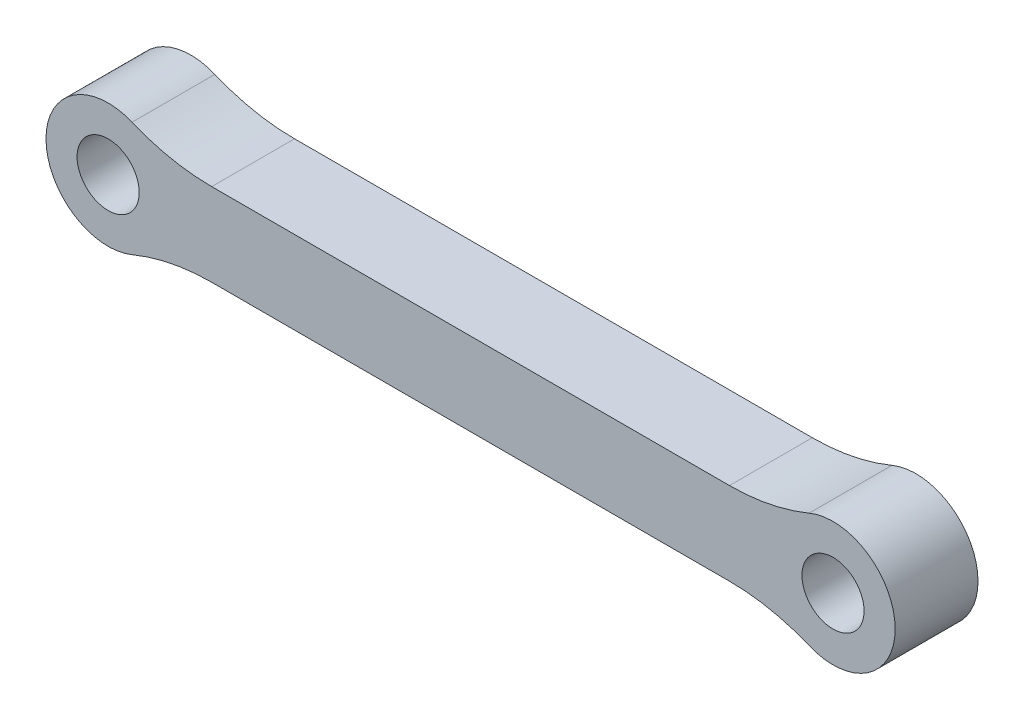
ISO-10303-21;
HEADER;
FILE_DESCRIPTION(('STEP AP214'),'2;1');
FILE_NAME('part.step','',(''),(''),'','','');
FILE_SCHEMA(('AUTOMOTIVE_DESIGN { 1 0 10303 214 1 1 1 1 }'));
ENDSEC;
DATA;
#1=APPLICATION_CONTEXT('core data for automotive mechanical design processes');
#2=APPLICATION_PROTOCOL_DEFINITION('international standard','automotive_design',2000,#1);
#3=PRODUCT_CONTEXT('',#1,'mechanical');
#4=PRODUCT('Part','Part','',(#3));
#5=PRODUCT_RELATED_PRODUCT_CATEGORY('part','',(#4));
#6=PRODUCT_DEFINITION_FORMATION('','',#4);
#7=PRODUCT_DEFINITION_CONTEXT('part definition',#1,'design');
#8=PRODUCT_DEFINITION('design','',#6,#7);
#9=PRODUCT_DEFINITION_SHAPE('','',#8);
#10=(LENGTH_UNIT() NAMED_UNIT(*) SI_UNIT(.MILLI.,.METRE.));
#11=(NAMED_UNIT(*) PLANE_ANGLE_UNIT() SI_UNIT($,.RADIAN.));
#12=(NAMED_UNIT(*) SI_UNIT($,.STERADIAN.) SOLID_ANGLE_UNIT());
#13=UNCERTAINTY_MEASURE_WITH_UNIT(LENGTH_MEASURE(1.E-05),#10,'distance_accuracy_value','');
#14=(GEOMETRIC_REPRESENTATION_CONTEXT(3) GLOBAL_UNCERTAINTY_ASSIGNED_CONTEXT((#13)) GLOBAL_UNIT_ASSIGNED_CONTEXT((#10,
#11,#12)) REPRESENTATION_CONTEXT('',''));
#15=CARTESIAN_POINT('',(0.,0.,0.));
#16=DIRECTION('',(0.,0.,1.));
#17=DIRECTION('',(1.,0.,0.));
#18=AXIS2_PLACEMENT_3D('',#15,#16,#17);
#19=CARTESIAN_POINT('',(0.,0.,4.));
#20=DIRECTION('',(0.,0.,1.));
#21=DIRECTION('',(1.,0.,0.));
#22=AXIS2_PLACEMENT_3D('',#19,#20,#21);
#23=PLANE('',#22);
#24=CARTESIAN_POINT('',(-31.8702055121114,0.,4.));
#25=DIRECTION('',(0.,0.,-1.));
#26=DIRECTION('',(-1.,0.,0.));
#27=AXIS2_PLACEMENT_3D('',#24,#25,#26);
#28=CIRCLE('',#27,3.);
#29=CARTESIAN_POINT('',(-30.7163593582652,-2.76923076923077,4.));
#30=VERTEX_POINT('',#29);
#31=CARTESIAN_POINT('',(-30.7163593582652,2.76923076923077,4.));
#32=VERTEX_POINT('',#31);
#33=EDGE_CURVE('E109',#30,#32,#28,.T.);
#34=ORIENTED_EDGE('',*,*,#33,.F.);
#35=CARTESIAN_POINT('',(-26.8702055121114,-12.,4.));
#36=DIRECTION('',(0.,0.,-1.));
#37=DIRECTION('',(-1.,0.,0.));
#38=AXIS2_PLACEMENT_3D('',#35,#36,#37);
#39=CIRCLE('',#38,10.);
#40=CARTESIAN_POINT('',(-26.8702055121114,-2.,4.));
#41=VERTEX_POINT('',#40);
#42=EDGE_CURVE('E105',#30,#41,#39,.T.);
#43=ORIENTED_EDGE('',*,*,#42,.T.);
#44=DIRECTION('',(1.,0.,0.));
#45=VECTOR('',#44,1.);
#46=CARTESIAN_POINT('',(0.,-2.,4.));
#47=LINE('',#46,#45);
#48=CARTESIAN_POINT('',(-1.87020551211136,-2.,4.));
#49=VERTEX_POINT('',#48);
#50=EDGE_CURVE('E263',#41,#49,#47,.T.);
#51=ORIENTED_EDGE('',*,*,#50,.T.);
#52=CARTESIAN_POINT('',(-1.87020551211136,-12.,4.));
#53=DIRECTION('',(0.,0.,-1.));
#54=DIRECTION('',(-1.,0.,0.));
#55=AXIS2_PLACEMENT_3D('',#52,#53,#54);
#56=CIRCLE('',#55,10.);
#57=CARTESIAN_POINT('',(1.97594833404249,-2.76923076923077,4.));
#58=VERTEX_POINT('',#57);
#59=EDGE_CURVE('E97',#49,#58,#56,.T.);
#60=ORIENTED_EDGE('',*,*,#59,.T.);
#61=CARTESIAN_POINT('',(3.12979448788864,0.,4.));
#62=DIRECTION('',(0.,0.,-1.));
#63=DIRECTION('',(-1.,0.,0.));
#64=AXIS2_PLACEMENT_3D('',#61,#62,#63);
#65=CIRCLE('',#64,3.);
#66=CARTESIAN_POINT('',(1.97594833404248,2.76923076923077,4.));
#67=VERTEX_POINT('',#66);
#68=EDGE_CURVE('E91',#67,#58,#65,.T.);
#69=ORIENTED_EDGE('',*,*,#68,.F.);
#70=CARTESIAN_POINT('',(-1.87020551211136,12.,4.));
#71=DIRECTION('',(0.,0.,-1.));
#72=DIRECTION('',(-1.,0.,0.));
#73=AXIS2_PLACEMENT_3D('',#70,#71,#72);
#74=CIRCLE('',#73,10.);
#75=CARTESIAN_POINT('',(-1.87020551211136,2.,4.));
#76=VERTEX_POINT('',#75);
#77=EDGE_CURVE('E79',#67,#76,#74,.T.);
#78=ORIENTED_EDGE('',*,*,#77,.T.);
#79=DIRECTION('',(1.,0.,0.));
#80=VECTOR('',#79,1.);
#81=CARTESIAN_POINT('',(0.,2.,4.));
#82=LINE('',#81,#80);
#83=CARTESIAN_POINT('',(-26.8702055121114,2.,4.));
#84=VERTEX_POINT('',#83);
#85=EDGE_CURVE('E87',#84,#76,#82,.T.);
#86=ORIENTED_EDGE('',*,*,#85,.F.);
#87=CARTESIAN_POINT('',(-26.8702055121114,12.,4.));
#88=DIRECTION('',(0.,0.,-1.));
#89=DIRECTION('',(-1.,0.,0.));
#90=AXIS2_PLACEMENT_3D('',#87,#88,#89);
#91=CIRCLE('',#90,10.);
#92=EDGE_CURVE('E112',#84,#32,#91,.T.);
#93=ORIENTED_EDGE('',*,*,#92,.T.);
#94=EDGE_LOOP('',(#34,#43,#51,#60,#69,#78,#86,#93));
#95=FACE_BOUND('',#94,.T.);
#96=CARTESIAN_POINT('',(3.12979448788864,0.,4.));
#97=DIRECTION('',(0.,0.,-1.));
#98=DIRECTION('',(-1.,0.,0.));
#99=AXIS2_PLACEMENT_3D('',#96,#97,#98);
#100=CIRCLE('',#99,1.5);
#101=CARTESIAN_POINT('',(1.62979448788864,0.,4.));
#102=VERTEX_POINT('',#101);
#103=EDGE_CURVE('E88',#102,#102,#100,.T.);
#104=ORIENTED_EDGE('',*,*,#103,.T.);
#105=EDGE_LOOP('',(#104));
#106=FACE_BOUND('',#105,.T.);
#107=CARTESIAN_POINT('',(-31.8702055121114,0.,4.));
#108=DIRECTION('',(0.,0.,-1.));
#109=DIRECTION('',(-1.,0.,0.));
#110=AXIS2_PLACEMENT_3D('',#107,#108,#109);
#111=CIRCLE('',#110,1.5);
#112=CARTESIAN_POINT('',(-33.3702055121114,0.,4.));
#113=VERTEX_POINT('',#112);
#114=EDGE_CURVE('E20',#113,#113,#111,.T.);
#115=ORIENTED_EDGE('',*,*,#114,.T.);
#116=EDGE_LOOP('',(#115));
#117=FACE_BOUND('',#116,.T.);
#118=ADVANCED_FACE('F17',(#95,#106,#117),#23,.T.);
#119=CARTESIAN_POINT('',(-31.8702055121114,0.,4.));
#120=DIRECTION('',(0.,0.,-1.));
#121=DIRECTION('',(-1.,0.,0.));
#122=AXIS2_PLACEMENT_3D('',#119,#120,#121);
#123=CYLINDRICAL_SURFACE('',#122,1.5);
#124=CARTESIAN_POINT('',(-31.8702055121114,0.,0.));
#125=DIRECTION('',(0.,0.,-1.));
#126=DIRECTION('',(-1.,0.,0.));
#127=AXIS2_PLACEMENT_3D('',#124,#125,#126);
#128=CIRCLE('',#127,1.5);
#129=CARTESIAN_POINT('',(-33.3702055121114,0.,0.));
#130=VERTEX_POINT('',#129);
#131=EDGE_CURVE('E93',#130,#130,#128,.T.);
#132=ORIENTED_EDGE('',*,*,#131,.T.);
#133=EDGE_LOOP('',(#132));
#134=FACE_BOUND('',#133,.T.);
#135=ORIENTED_EDGE('',*,*,#114,.F.);
#136=EDGE_LOOP('',(#135));
#137=FACE_BOUND('',#136,.T.);
#138=ADVANCED_FACE('F121',(#134,#137),#123,.F.);
#139=CARTESIAN_POINT('',(3.12979448788864,0.,4.));
#140=DIRECTION('',(0.,0.,-1.));
#141=DIRECTION('',(-1.,0.,0.));
#142=AXIS2_PLACEMENT_3D('',#139,#140,#141);
#143=CYLINDRICAL_SURFACE('',#142,1.5);
#144=CARTESIAN_POINT('',(3.12979448788864,0.,0.));
#145=DIRECTION('',(0.,0.,-1.));
#146=DIRECTION('',(-1.,0.,0.));
#147=AXIS2_PLACEMENT_3D('',#144,#145,#146);
#148=CIRCLE('',#147,1.5);
#149=CARTESIAN_POINT('',(1.62979448788864,0.,0.));
#150=VERTEX_POINT('',#149);
#151=EDGE_CURVE('E256',#150,#150,#148,.T.);
#152=ORIENTED_EDGE('',*,*,#151,.T.);
#153=EDGE_LOOP('',(#152));
#154=FACE_BOUND('',#153,.T.);
#155=ORIENTED_EDGE('',*,*,#103,.F.);
#156=EDGE_LOOP('',(#155));
#157=FACE_BOUND('',#156,.T.);
#158=ADVANCED_FACE('F123',(#154,#157),#143,.F.);
#159=CARTESIAN_POINT('',(-1.87020551211136,12.,4.));
#160=DIRECTION('',(0.,0.,-1.));
#161=DIRECTION('',(-1.,0.,0.));
#162=AXIS2_PLACEMENT_3D('',#159,#160,#161);
#163=CYLINDRICAL_SURFACE('',#162,10.);
#164=DIRECTION('',(0.,0.,-1.));
#165=VECTOR('',#164,1.);
#166=CARTESIAN_POINT('',(1.97594833404248,2.76923076923077,4.));
#167=LINE('',#166,#165);
#168=CARTESIAN_POINT('',(1.97594833404248,2.76923076923077,0.));
#169=VERTEX_POINT('',#168);
#170=EDGE_CURVE('E83',#169,#67,#167,.F.);
#171=ORIENTED_EDGE('',*,*,#170,.F.);
#172=CARTESIAN_POINT('',(-1.87020551211136,12.,0.));
#173=DIRECTION('',(0.,0.,-1.));
#174=DIRECTION('',(-1.,0.,0.));
#175=AXIS2_PLACEMENT_3D('',#172,#173,#174);
#176=CIRCLE('',#175,10.);
#177=CARTESIAN_POINT('',(-1.87020551211136,2.,0.));
#178=VERTEX_POINT('',#177);
#179=EDGE_CURVE('E251',#169,#178,#176,.T.);
#180=ORIENTED_EDGE('',*,*,#179,.T.);
#181=DIRECTION('',(0.,0.,1.));
#182=VECTOR('',#181,1.);
#183=CARTESIAN_POINT('',(-1.87020551211136,2.,4.));
#184=LINE('',#183,#182);
#185=EDGE_CURVE('E84',#76,#178,#184,.F.);
#186=ORIENTED_EDGE('',*,*,#185,.F.);
#187=ORIENTED_EDGE('',*,*,#77,.F.);
#188=EDGE_LOOP('',(#171,#180,#186,#187));
#189=FACE_BOUND('',#188,.T.);
#190=ADVANCED_FACE('F81',(#189),#163,.F.);
#191=CARTESIAN_POINT('',(0.,2.,4.));
#192=DIRECTION('',(0.,1.,0.));
#193=DIRECTION('',(0.,0.,1.));
#194=AXIS2_PLACEMENT_3D('',#191,#192,#193);
#195=PLANE('',#194);
#196=DIRECTION('',(1.,0.,0.));
#197=VECTOR('',#196,1.);
#198=CARTESIAN_POINT('',(0.,2.,0.));
#199=LINE('',#198,#197);
#200=CARTESIAN_POINT('',(-26.8702055121114,2.,0.));
#201=VERTEX_POINT('',#200);
#202=EDGE_CURVE('E247',#178,#201,#199,.F.);
#203=ORIENTED_EDGE('',*,*,#202,.T.);
#204=DIRECTION('',(0.,0.,-1.));
#205=VECTOR('',#204,1.);
#206=CARTESIAN_POINT('',(-26.8702055121114,2.,4.));
#207=LINE('',#206,#205);
#208=EDGE_CURVE('E114',#201,#84,#207,.F.);
#209=ORIENTED_EDGE('',*,*,#208,.T.);
#210=ORIENTED_EDGE('',*,*,#85,.T.);
#211=ORIENTED_EDGE('',*,*,#185,.T.);
#212=EDGE_LOOP('',(#203,#209,#210,#211));
#213=FACE_BOUND('',#212,.T.);
#214=ADVANCED_FACE('F163',(#213),#195,.T.);
#215=CARTESIAN_POINT('',(-26.8702055121114,12.,4.));
#216=DIRECTION('',(0.,0.,-1.));
#217=DIRECTION('',(-1.,0.,0.));
#218=AXIS2_PLACEMENT_3D('',#215,#216,#217);
#219=CYLINDRICAL_SURFACE('',#218,10.);
#220=ORIENTED_EDGE('',*,*,#208,.F.);
#221=CARTESIAN_POINT('',(-26.8702055121114,12.,0.));
#222=DIRECTION('',(0.,0.,-1.));
#223=DIRECTION('',(-1.,0.,0.));
#224=AXIS2_PLACEMENT_3D('',#221,#222,#223);
#225=CIRCLE('',#224,10.);
#226=CARTESIAN_POINT('',(-30.7163593582652,2.76923076923077,0.));
#227=VERTEX_POINT('',#226);
#228=EDGE_CURVE('E250',#201,#227,#225,.T.);
#229=ORIENTED_EDGE('',*,*,#228,.T.);
#230=DIRECTION('',(0.,0.,-1.));
#231=VECTOR('',#230,1.);
#232=CARTESIAN_POINT('',(-30.7163593582652,2.76923076923077,4.));
#233=LINE('',#232,#231);
#234=EDGE_CURVE('E111',#32,#227,#233,.T.);
#235=ORIENTED_EDGE('',*,*,#234,.F.);
#236=ORIENTED_EDGE('',*,*,#92,.F.);
#237=EDGE_LOOP('',(#220,#229,#235,#236));
#238=FACE_BOUND('',#237,.T.);
#239=ADVANCED_FACE('F159',(#238),#219,.F.);
#240=CARTESIAN_POINT('',(-31.8702055121114,0.,4.));
#241=DIRECTION('',(0.,0.,-1.));
#242=DIRECTION('',(-1.,0.,0.));
#243=AXIS2_PLACEMENT_3D('',#240,#241,#242);
#244=CYLINDRICAL_SURFACE('',#243,3.);
#245=CARTESIAN_POINT('',(-31.8702055121114,0.,0.));
#246=DIRECTION('',(0.,0.,-1.));
#247=DIRECTION('',(-1.,0.,0.));
#248=AXIS2_PLACEMENT_3D('',#245,#246,#247);
#249=CIRCLE('',#248,3.);
#250=CARTESIAN_POINT('',(-30.7163593582652,-2.76923076923077,0.));
#251=VERTEX_POINT('',#250);
#252=EDGE_CURVE('E254',#227,#251,#249,.F.);
#253=ORIENTED_EDGE('',*,*,#252,.T.);
#254=DIRECTION('',(0.,0.,-1.));
#255=VECTOR('',#254,1.);
#256=CARTESIAN_POINT('',(-30.7163593582652,-2.76923076923077,4.));
#257=LINE('',#256,#255);
#258=EDGE_CURVE('E108',#251,#30,#257,.F.);
#259=ORIENTED_EDGE('',*,*,#258,.T.);
#260=ORIENTED_EDGE('',*,*,#33,.T.);
#261=ORIENTED_EDGE('',*,*,#234,.T.);
#262=EDGE_LOOP('',(#253,#259,#260,#261));
#263=FACE_BOUND('',#262,.T.);
#264=ADVANCED_FACE('F155',(#263),#244,.T.);
#265=CARTESIAN_POINT('',(-26.8702055121114,-12.,4.));
#266=DIRECTION('',(0.,0.,-1.));
#267=DIRECTION('',(-1.,0.,0.));
#268=AXIS2_PLACEMENT_3D('',#265,#266,#267);
#269=CYLINDRICAL_SURFACE('',#268,10.);
#270=ORIENTED_EDGE('',*,*,#258,.F.);
#271=CARTESIAN_POINT('',(-26.8702055121114,-12.,0.));
#272=DIRECTION('',(0.,0.,-1.));
#273=DIRECTION('',(-1.,0.,0.));
#274=AXIS2_PLACEMENT_3D('',#271,#272,#273);
#275=CIRCLE('',#274,10.);
#276=CARTESIAN_POINT('',(-26.8702055121114,-2.,0.));
#277=VERTEX_POINT('',#276);
#278=EDGE_CURVE('E275',#251,#277,#275,.T.);
#279=ORIENTED_EDGE('',*,*,#278,.T.);
#280=DIRECTION('',(0.,0.,1.));
#281=VECTOR('',#280,1.);
#282=CARTESIAN_POINT('',(-26.8702055121114,-2.,4.));
#283=LINE('',#282,#281);
#284=EDGE_CURVE('E107',#277,#41,#283,.T.);
#285=ORIENTED_EDGE('',*,*,#284,.T.);
#286=ORIENTED_EDGE('',*,*,#42,.F.);
#287=EDGE_LOOP('',(#270,#279,#285,#286));
#288=FACE_BOUND('',#287,.T.);
#289=ADVANCED_FACE('F151',(#288),#269,.F.);
#290=CARTESIAN_POINT('',(0.,-2.,4.));
#291=DIRECTION('',(0.,1.,0.));
#292=DIRECTION('',(0.,0.,1.));
#293=AXIS2_PLACEMENT_3D('',#290,#291,#292);
#294=PLANE('',#293);
#295=DIRECTION('',(0.,0.,-1.));
#296=VECTOR('',#295,1.);
#297=CARTESIAN_POINT('',(-1.87020551211136,-2.,4.));
#298=LINE('',#297,#296);
#299=CARTESIAN_POINT('',(-1.87020551211136,-2.,0.));
#300=VERTEX_POINT('',#299);
#301=EDGE_CURVE('E100',#300,#49,#298,.F.);
#302=ORIENTED_EDGE('',*,*,#301,.T.);
#303=ORIENTED_EDGE('',*,*,#50,.F.);
#304=ORIENTED_EDGE('',*,*,#284,.F.);
#305=DIRECTION('',(1.,0.,0.));
#306=VECTOR('',#305,1.);
#307=CARTESIAN_POINT('',(0.,-2.,0.));
#308=LINE('',#307,#306);
#309=EDGE_CURVE('E259',#277,#300,#308,.T.);
#310=ORIENTED_EDGE('',*,*,#309,.T.);
#311=EDGE_LOOP('',(#302,#303,#304,#310));
#312=FACE_BOUND('',#311,.T.);
#313=ADVANCED_FACE('F147',(#312),#294,.F.);
#314=CARTESIAN_POINT('',(-1.87020551211136,-12.,4.));
#315=DIRECTION('',(0.,0.,-1.));
#316=DIRECTION('',(-1.,0.,0.));
#317=AXIS2_PLACEMENT_3D('',#314,#315,#316);
#318=CYLINDRICAL_SURFACE('',#317,10.);
#319=ORIENTED_EDGE('',*,*,#301,.F.);
#320=CARTESIAN_POINT('',(-1.87020551211136,-12.,0.));
#321=DIRECTION('',(0.,0.,-1.));
#322=DIRECTION('',(-1.,0.,0.));
#323=AXIS2_PLACEMENT_3D('',#320,#321,#322);
#324=CIRCLE('',#323,10.);
#325=CARTESIAN_POINT('',(1.97594833404249,-2.76923076923077,0.));
#326=VERTEX_POINT('',#325);
#327=EDGE_CURVE('E26',#300,#326,#324,.T.);
#328=ORIENTED_EDGE('',*,*,#327,.T.);
#329=DIRECTION('',(0.,0.,-1.));
#330=VECTOR('',#329,1.);
#331=CARTESIAN_POINT('',(1.97594833404249,-2.76923076923077,4.));
#332=LINE('',#331,#330);
#333=EDGE_CURVE('E34',#58,#326,#332,.T.);
#334=ORIENTED_EDGE('',*,*,#333,.F.);
#335=ORIENTED_EDGE('',*,*,#59,.F.);
#336=EDGE_LOOP('',(#319,#328,#334,#335));
#337=FACE_BOUND('',#336,.T.);
#338=ADVANCED_FACE('F140',(#337),#318,.F.);
#339=CARTESIAN_POINT('',(3.12979448788864,0.,4.));
#340=DIRECTION('',(0.,0.,-1.));
#341=DIRECTION('',(-1.,0.,0.));
#342=AXIS2_PLACEMENT_3D('',#339,#340,#341);
#343=CYLINDRICAL_SURFACE('',#342,3.);
#344=CARTESIAN_POINT('',(3.12979448788864,0.,0.));
#345=DIRECTION('',(0.,0.,-1.));
#346=DIRECTION('',(-1.,0.,0.));
#347=AXIS2_PLACEMENT_3D('',#344,#345,#346);
#348=CIRCLE('',#347,3.);
#349=EDGE_CURVE('E11',#326,#169,#348,.F.);
#350=ORIENTED_EDGE('',*,*,#349,.T.);
#351=ORIENTED_EDGE('',*,*,#170,.T.);
#352=ORIENTED_EDGE('',*,*,#68,.T.);
#353=ORIENTED_EDGE('',*,*,#333,.T.);
#354=EDGE_LOOP('',(#350,#351,#352,#353));
#355=FACE_BOUND('',#354,.T.);
#356=ADVANCED_FACE('F90',(#355),#343,.T.);
#357=CARTESIAN_POINT('',(0.,0.,0.));
#358=DIRECTION('',(0.,0.,1.));
#359=DIRECTION('',(1.,0.,0.));
#360=AXIS2_PLACEMENT_3D('',#357,#358,#359);
#361=PLANE('',#360);
#362=ORIENTED_EDGE('',*,*,#327,.F.);
#363=ORIENTED_EDGE('',*,*,#309,.F.);
#364=ORIENTED_EDGE('',*,*,#278,.F.);
#365=ORIENTED_EDGE('',*,*,#252,.F.);
#366=ORIENTED_EDGE('',*,*,#228,.F.);
#367=ORIENTED_EDGE('',*,*,#202,.F.);
#368=ORIENTED_EDGE('',*,*,#179,.F.);
#369=ORIENTED_EDGE('',*,*,#349,.F.);
#370=EDGE_LOOP('',(#362,#363,#364,#365,#366,#367,#368,#369));
#371=FACE_BOUND('',#370,.T.);
#372=ORIENTED_EDGE('',*,*,#151,.F.);
#373=EDGE_LOOP('',(#372));
#374=FACE_BOUND('',#373,.T.);
#375=ORIENTED_EDGE('',*,*,#131,.F.);
#376=EDGE_LOOP('',(#375));
#377=FACE_BOUND('',#376,.T.);
#378=ADVANCED_FACE('F133',(#371,#374,#377),#361,.F.);
#379=CLOSED_SHELL('',(#118,#138,#158,#190,#214,#239,#264,#289,#313,#338,#356,#378));
#380=MANIFOLD_SOLID_BREP('B1',#379);
#381=ADVANCED_BREP_SHAPE_REPRESENTATION('',(#18,#380),#14);
#382=SHAPE_DEFINITION_REPRESENTATION(#9,#381);
ENDSEC;
END-ISO-10303-21;
